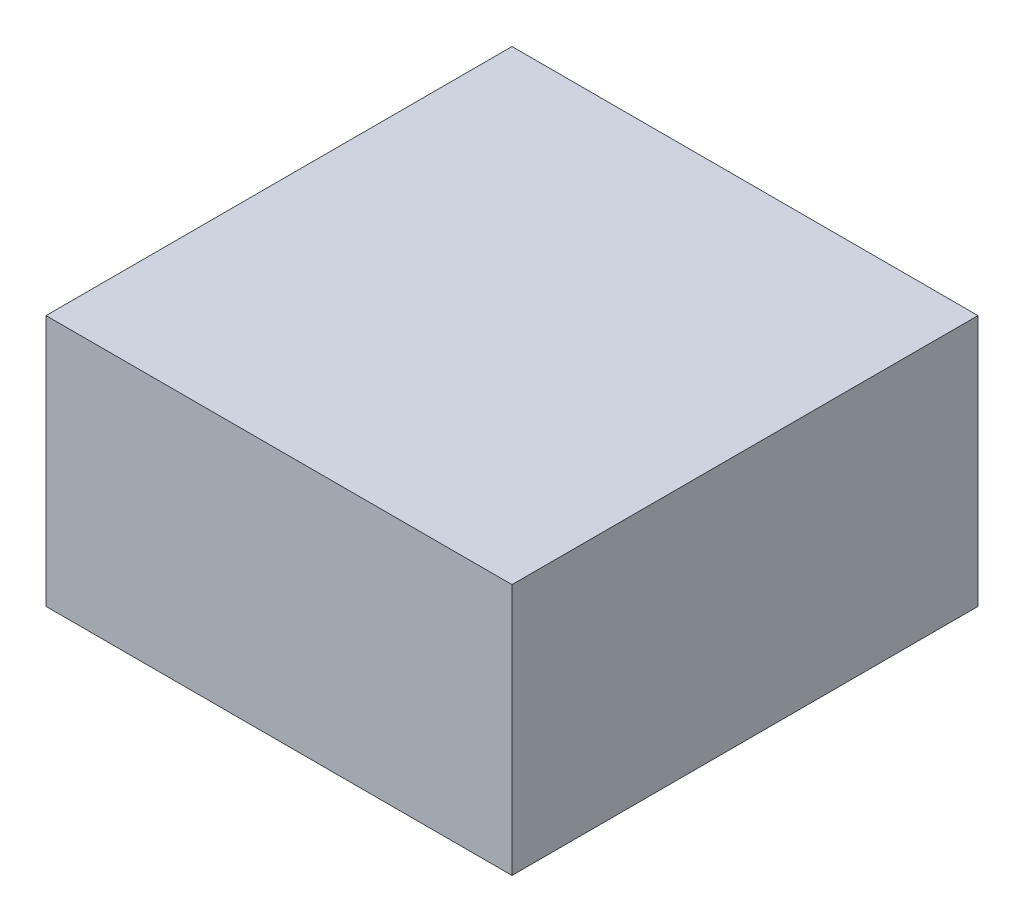
ISO-10303-21;
HEADER;
FILE_DESCRIPTION(('STEP AP214'),'2;1');
FILE_NAME('part.step','',(''),(''),'','','');
FILE_SCHEMA(('AUTOMOTIVE_DESIGN { 1 0 10303 214 1 1 1 1 }'));
ENDSEC;
DATA;
#1=APPLICATION_CONTEXT('core data for automotive mechanical design processes');
#2=APPLICATION_PROTOCOL_DEFINITION('international standard','automotive_design',2000,#1);
#3=PRODUCT_CONTEXT('',#1,'mechanical');
#4=PRODUCT('Part','Part','',(#3));
#5=PRODUCT_RELATED_PRODUCT_CATEGORY('part','',(#4));
#6=PRODUCT_DEFINITION_FORMATION('','',#4);
#7=PRODUCT_DEFINITION_CONTEXT('part definition',#1,'design');
#8=PRODUCT_DEFINITION('design','',#6,#7);
#9=PRODUCT_DEFINITION_SHAPE('','',#8);
#10=(LENGTH_UNIT() NAMED_UNIT(*) SI_UNIT(.MILLI.,.METRE.));
#11=(NAMED_UNIT(*) PLANE_ANGLE_UNIT() SI_UNIT($,.RADIAN.));
#12=(NAMED_UNIT(*) SI_UNIT($,.STERADIAN.) SOLID_ANGLE_UNIT());
#13=UNCERTAINTY_MEASURE_WITH_UNIT(LENGTH_MEASURE(1.E-05),#10,'distance_accuracy_value','');
#14=(GEOMETRIC_REPRESENTATION_CONTEXT(3) GLOBAL_UNCERTAINTY_ASSIGNED_CONTEXT((#13)) GLOBAL_UNIT_ASSIGNED_CONTEXT((#10,
#11,#12)) REPRESENTATION_CONTEXT('',''));
#15=CARTESIAN_POINT('',(0.,0.,0.));
#16=DIRECTION('',(0.,0.,1.));
#17=DIRECTION('',(1.,0.,0.));
#18=AXIS2_PLACEMENT_3D('',#15,#16,#17);
#19=CARTESIAN_POINT('',(0.,0.,0.));
#20=DIRECTION('',(0.,1.,0.));
#21=DIRECTION('',(0.,0.,1.));
#22=AXIS2_PLACEMENT_3D('',#19,#20,#21);
#23=PLANE('',#22);
#24=DIRECTION('',(0.,0.,1.));
#25=VECTOR('',#24,1.);
#26=CARTESIAN_POINT('',(-63.9353314093189,0.,-19.5600550966808));
#27=LINE('',#26,#25);
#28=CARTESIAN_POINT('',(-63.9353314093189,0.,-19.5600550966808));
#29=VERTEX_POINT('',#28);
#30=CARTESIAN_POINT('',(-63.9353314093189,0.,-1.06005509668079));
#31=VERTEX_POINT('',#30);
#32=EDGE_CURVE('E193',#29,#31,#27,.T.);
#33=ORIENTED_EDGE('',*,*,#32,.F.);
#34=DIRECTION('',(1.,0.,0.));
#35=VECTOR('',#34,1.);
#36=CARTESIAN_POINT('',(-63.9353314093189,0.,-19.5600550966808));
#37=LINE('',#36,#35);
#38=CARTESIAN_POINT('',(-45.4353314093189,0.,-19.5600550966808));
#39=VERTEX_POINT('',#38);
#40=EDGE_CURVE('E202',#29,#39,#37,.T.);
#41=ORIENTED_EDGE('',*,*,#40,.T.);
#42=DIRECTION('',(0.,0.,1.));
#43=VECTOR('',#42,1.);
#44=CARTESIAN_POINT('',(-45.4353314093189,0.,-19.5600550966808));
#45=LINE('',#44,#43);
#46=CARTESIAN_POINT('',(-45.4353314093189,0.,-1.06005509668079));
#47=VERTEX_POINT('',#46);
#48=EDGE_CURVE('E215',#39,#47,#45,.T.);
#49=ORIENTED_EDGE('',*,*,#48,.T.);
#50=DIRECTION('',(1.,0.,0.));
#51=VECTOR('',#50,1.);
#52=CARTESIAN_POINT('',(-63.9353314093189,0.,-1.06005509668079));
#53=LINE('',#52,#51);
#54=EDGE_CURVE('E209',#31,#47,#53,.T.);
#55=ORIENTED_EDGE('',*,*,#54,.F.);
#56=EDGE_LOOP('',(#33,#41,#49,#55));
#57=FACE_BOUND('',#56,.T.);
#58=DIRECTION('',(0.,0.,1.));
#59=VECTOR('',#58,1.);
#60=CARTESIAN_POINT('',(-47.1853261692801,0.,0.));
#61=LINE('',#60,#59);
#62=CARTESIAN_POINT('',(-47.1853261692801,0.,-17.8100529018971));
#63=VERTEX_POINT('',#62);
#64=CARTESIAN_POINT('',(-47.1853261692801,0.,-2.81005290189709));
#65=VERTEX_POINT('',#64);
#66=EDGE_CURVE('E12',#63,#65,#61,.T.);
#67=ORIENTED_EDGE('',*,*,#66,.F.);
#68=DIRECTION('',(1.,0.,0.));
#69=VECTOR('',#68,1.);
#70=CARTESIAN_POINT('',(0.,0.,-17.8100529018971));
#71=LINE('',#70,#69);
#72=CARTESIAN_POINT('',(-62.1853261692801,0.,-17.8100529018971));
#73=VERTEX_POINT('',#72);
#74=EDGE_CURVE('E175',#73,#63,#71,.T.);
#75=ORIENTED_EDGE('',*,*,#74,.F.);
#76=DIRECTION('',(0.,0.,1.));
#77=VECTOR('',#76,1.);
#78=CARTESIAN_POINT('',(-62.1853261692801,0.,0.));
#79=LINE('',#78,#77);
#80=CARTESIAN_POINT('',(-62.1853261692801,0.,-2.81005290189709));
#81=VERTEX_POINT('',#80);
#82=EDGE_CURVE('E223',#73,#81,#79,.T.);
#83=ORIENTED_EDGE('',*,*,#82,.T.);
#84=DIRECTION('',(1.,0.,0.));
#85=VECTOR('',#84,1.);
#86=CARTESIAN_POINT('',(0.,0.,-2.81005290189709));
#87=LINE('',#86,#85);
#88=EDGE_CURVE('E101',#81,#65,#87,.T.);
#89=ORIENTED_EDGE('',*,*,#88,.T.);
#90=EDGE_LOOP('',(#67,#75,#83,#89));
#91=FACE_BOUND('',#90,.T.);
#92=ADVANCED_FACE('F93',(#57,#91),#23,.F.);
#93=CARTESIAN_POINT('',(-63.9353314093189,10.,-19.5600550966808));
#94=DIRECTION('',(1.,0.,0.));
#95=DIRECTION('',(0.,0.,-1.));
#96=AXIS2_PLACEMENT_3D('',#93,#94,#95);
#97=PLANE('',#96);
#98=ORIENTED_EDGE('',*,*,#32,.T.);
#99=DIRECTION('',(0.,-1.,0.));
#100=VECTOR('',#99,1.);
#101=CARTESIAN_POINT('',(-63.9353314093189,10.,-1.06005509668079));
#102=LINE('',#101,#100);
#103=CARTESIAN_POINT('',(-63.9353314093189,10.,-1.06005509668079));
#104=VERTEX_POINT('',#103);
#105=EDGE_CURVE('E225',#104,#31,#102,.T.);
#106=ORIENTED_EDGE('',*,*,#105,.F.);
#107=DIRECTION('',(0.,0.,1.));
#108=VECTOR('',#107,1.);
#109=CARTESIAN_POINT('',(-63.9353314093189,10.,-19.5600550966808));
#110=LINE('',#109,#108);
#111=CARTESIAN_POINT('',(-63.9353314093189,10.,-19.5600550966808));
#112=VERTEX_POINT('',#111);
#113=EDGE_CURVE('E196',#112,#104,#110,.T.);
#114=ORIENTED_EDGE('',*,*,#113,.F.);
#115=DIRECTION('',(0.,-1.,0.));
#116=VECTOR('',#115,1.);
#117=CARTESIAN_POINT('',(-63.9353314093189,10.,-19.5600550966808));
#118=LINE('',#117,#116);
#119=EDGE_CURVE('E118',#112,#29,#118,.T.);
#120=ORIENTED_EDGE('',*,*,#119,.T.);
#121=EDGE_LOOP('',(#98,#106,#114,#120));
#122=FACE_BOUND('',#121,.T.);
#123=ADVANCED_FACE('F97',(#122),#97,.F.);
#124=CARTESIAN_POINT('',(-63.9353314093189,10.,-1.06005509668079));
#125=DIRECTION('',(0.,0.,-1.));
#126=DIRECTION('',(-1.,0.,0.));
#127=AXIS2_PLACEMENT_3D('',#124,#125,#126);
#128=PLANE('',#127);
#129=ORIENTED_EDGE('',*,*,#54,.T.);
#130=DIRECTION('',(0.,-1.,0.));
#131=VECTOR('',#130,1.);
#132=CARTESIAN_POINT('',(-45.4353314093189,10.,-1.06005509668079));
#133=LINE('',#132,#131);
#134=CARTESIAN_POINT('',(-45.4353314093189,10.,-1.06005509668079));
#135=VERTEX_POINT('',#134);
#136=EDGE_CURVE('E218',#135,#47,#133,.T.);
#137=ORIENTED_EDGE('',*,*,#136,.F.);
#138=DIRECTION('',(1.,0.,0.));
#139=VECTOR('',#138,1.);
#140=CARTESIAN_POINT('',(-63.9353314093189,10.,-1.06005509668079));
#141=LINE('',#140,#139);
#142=EDGE_CURVE('E147',#104,#135,#141,.T.);
#143=ORIENTED_EDGE('',*,*,#142,.F.);
#144=ORIENTED_EDGE('',*,*,#105,.T.);
#145=EDGE_LOOP('',(#129,#137,#143,#144));
#146=FACE_BOUND('',#145,.T.);
#147=ADVANCED_FACE('F249',(#146),#128,.F.);
#148=CARTESIAN_POINT('',(-45.4353314093189,10.,-19.5600550966808));
#149=DIRECTION('',(1.,0.,0.));
#150=DIRECTION('',(0.,0.,-1.));
#151=AXIS2_PLACEMENT_3D('',#148,#149,#150);
#152=PLANE('',#151);
#153=ORIENTED_EDGE('',*,*,#48,.F.);
#154=DIRECTION('',(0.,-1.,0.));
#155=VECTOR('',#154,1.);
#156=CARTESIAN_POINT('',(-45.4353314093189,10.,-19.5600550966808));
#157=LINE('',#156,#155);
#158=CARTESIAN_POINT('',(-45.4353314093189,10.,-19.5600550966808));
#159=VERTEX_POINT('',#158);
#160=EDGE_CURVE('E220',#159,#39,#157,.T.);
#161=ORIENTED_EDGE('',*,*,#160,.F.);
#162=DIRECTION('',(0.,0.,1.));
#163=VECTOR('',#162,1.);
#164=CARTESIAN_POINT('',(-45.4353314093189,10.,-19.5600550966808));
#165=LINE('',#164,#163);
#166=EDGE_CURVE('E204',#159,#135,#165,.T.);
#167=ORIENTED_EDGE('',*,*,#166,.T.);
#168=ORIENTED_EDGE('',*,*,#136,.T.);
#169=EDGE_LOOP('',(#153,#161,#167,#168));
#170=FACE_BOUND('',#169,.T.);
#171=ADVANCED_FACE('F259',(#170),#152,.T.);
#172=CARTESIAN_POINT('',(-63.9353314093189,10.,-19.5600550966808));
#173=DIRECTION('',(0.,0.,-1.));
#174=DIRECTION('',(-1.,0.,0.));
#175=AXIS2_PLACEMENT_3D('',#172,#173,#174);
#176=PLANE('',#175);
#177=ORIENTED_EDGE('',*,*,#40,.F.);
#178=ORIENTED_EDGE('',*,*,#119,.F.);
#179=DIRECTION('',(1.,0.,0.));
#180=VECTOR('',#179,1.);
#181=CARTESIAN_POINT('',(-63.9353314093189,10.,-19.5600550966808));
#182=LINE('',#181,#180);
#183=EDGE_CURVE('E207',#112,#159,#182,.T.);
#184=ORIENTED_EDGE('',*,*,#183,.T.);
#185=ORIENTED_EDGE('',*,*,#160,.T.);
#186=EDGE_LOOP('',(#177,#178,#184,#185));
#187=FACE_BOUND('',#186,.T.);
#188=ADVANCED_FACE('F253',(#187),#176,.T.);
#189=CARTESIAN_POINT('',(0.,10.,0.));
#190=DIRECTION('',(0.,1.,0.));
#191=DIRECTION('',(0.,0.,1.));
#192=AXIS2_PLACEMENT_3D('',#189,#190,#191);
#193=PLANE('',#192);
#194=ORIENTED_EDGE('',*,*,#113,.T.);
#195=ORIENTED_EDGE('',*,*,#142,.T.);
#196=ORIENTED_EDGE('',*,*,#166,.F.);
#197=ORIENTED_EDGE('',*,*,#183,.F.);
#198=EDGE_LOOP('',(#194,#195,#196,#197));
#199=FACE_BOUND('',#198,.T.);
#200=ADVANCED_FACE('F254',(#199),#193,.T.);
#201=CARTESIAN_POINT('',(-47.1853261692801,-10.,0.));
#202=DIRECTION('',(-1.,0.,0.));
#203=DIRECTION('',(0.,0.,1.));
#204=AXIS2_PLACEMENT_3D('',#201,#202,#203);
#205=PLANE('',#204);
#206=ORIENTED_EDGE('',*,*,#66,.T.);
#207=DIRECTION('',(0.,1.,0.));
#208=VECTOR('',#207,1.);
#209=CARTESIAN_POINT('',(-47.1853261692801,-10.,-2.81005290189709));
#210=LINE('',#209,#208);
#211=CARTESIAN_POINT('',(-47.1853261692801,8.,-2.81005290189709));
#212=VERTEX_POINT('',#211);
#213=EDGE_CURVE('E181',#65,#212,#210,.T.);
#214=ORIENTED_EDGE('',*,*,#213,.T.);
#215=DIRECTION('',(0.,0.,1.));
#216=VECTOR('',#215,1.);
#217=CARTESIAN_POINT('',(-47.1853261692801,8.,0.));
#218=LINE('',#217,#216);
#219=CARTESIAN_POINT('',(-47.1853261692801,8.,-17.8100529018971));
#220=VERTEX_POINT('',#219);
#221=EDGE_CURVE('E178',#220,#212,#218,.T.);
#222=ORIENTED_EDGE('',*,*,#221,.F.);
#223=DIRECTION('',(0.,1.,0.));
#224=VECTOR('',#223,1.);
#225=CARTESIAN_POINT('',(-47.1853261692801,-10.,-17.8100529018971));
#226=LINE('',#225,#224);
#227=EDGE_CURVE('E168',#63,#220,#226,.T.);
#228=ORIENTED_EDGE('',*,*,#227,.F.);
#229=EDGE_LOOP('',(#206,#214,#222,#228));
#230=FACE_BOUND('',#229,.T.);
#231=ADVANCED_FACE('F177',(#230),#205,.T.);
#232=CARTESIAN_POINT('',(0.,-10.,-2.81005290189709));
#233=DIRECTION('',(0.,0.,1.));
#234=DIRECTION('',(1.,0.,0.));
#235=AXIS2_PLACEMENT_3D('',#232,#233,#234);
#236=PLANE('',#235);
#237=DIRECTION('',(0.,1.,0.));
#238=VECTOR('',#237,1.);
#239=CARTESIAN_POINT('',(-62.1853261692801,-10.,-2.81005290189709));
#240=LINE('',#239,#238);
#241=CARTESIAN_POINT('',(-62.1853261692801,8.,-2.81005290189709));
#242=VERTEX_POINT('',#241);
#243=EDGE_CURVE('E197',#81,#242,#240,.T.);
#244=ORIENTED_EDGE('',*,*,#243,.T.);
#245=DIRECTION('',(1.,0.,0.));
#246=VECTOR('',#245,1.);
#247=CARTESIAN_POINT('',(0.,8.,-2.81005290189709));
#248=LINE('',#247,#246);
#249=EDGE_CURVE('E174',#242,#212,#248,.T.);
#250=ORIENTED_EDGE('',*,*,#249,.T.);
#251=ORIENTED_EDGE('',*,*,#213,.F.);
#252=ORIENTED_EDGE('',*,*,#88,.F.);
#253=EDGE_LOOP('',(#244,#250,#251,#252));
#254=FACE_BOUND('',#253,.T.);
#255=ADVANCED_FACE('F233',(#254),#236,.F.);
#256=CARTESIAN_POINT('',(-62.1853261692801,-10.,0.));
#257=DIRECTION('',(-1.,0.,0.));
#258=DIRECTION('',(0.,0.,1.));
#259=AXIS2_PLACEMENT_3D('',#256,#257,#258);
#260=PLANE('',#259);
#261=DIRECTION('',(0.,1.,0.));
#262=VECTOR('',#261,1.);
#263=CARTESIAN_POINT('',(-62.1853261692801,-10.,-17.8100529018971));
#264=LINE('',#263,#262);
#265=CARTESIAN_POINT('',(-62.1853261692801,8.,-17.8100529018971));
#266=VERTEX_POINT('',#265);
#267=EDGE_CURVE('E109',#73,#266,#264,.T.);
#268=ORIENTED_EDGE('',*,*,#267,.T.);
#269=DIRECTION('',(0.,0.,1.));
#270=VECTOR('',#269,1.);
#271=CARTESIAN_POINT('',(-62.1853261692801,8.,0.));
#272=LINE('',#271,#270);
#273=EDGE_CURVE('E186',#266,#242,#272,.T.);
#274=ORIENTED_EDGE('',*,*,#273,.T.);
#275=ORIENTED_EDGE('',*,*,#243,.F.);
#276=ORIENTED_EDGE('',*,*,#82,.F.);
#277=EDGE_LOOP('',(#268,#274,#275,#276));
#278=FACE_BOUND('',#277,.T.);
#279=ADVANCED_FACE('F231',(#278),#260,.F.);
#280=CARTESIAN_POINT('',(0.,-10.,-17.8100529018971));
#281=DIRECTION('',(0.,0.,1.));
#282=DIRECTION('',(1.,0.,0.));
#283=AXIS2_PLACEMENT_3D('',#280,#281,#282);
#284=PLANE('',#283);
#285=ORIENTED_EDGE('',*,*,#74,.T.);
#286=ORIENTED_EDGE('',*,*,#227,.T.);
#287=DIRECTION('',(1.,0.,0.));
#288=VECTOR('',#287,1.);
#289=CARTESIAN_POINT('',(0.,8.,-17.8100529018971));
#290=LINE('',#289,#288);
#291=EDGE_CURVE('E167',#266,#220,#290,.T.);
#292=ORIENTED_EDGE('',*,*,#291,.F.);
#293=ORIENTED_EDGE('',*,*,#267,.F.);
#294=EDGE_LOOP('',(#285,#286,#292,#293));
#295=FACE_BOUND('',#294,.T.);
#296=ADVANCED_FACE('F166',(#295),#284,.T.);
#297=CARTESIAN_POINT('',(0.,8.,0.));
#298=DIRECTION('',(0.,1.,0.));
#299=DIRECTION('',(0.,0.,1.));
#300=AXIS2_PLACEMENT_3D('',#297,#298,#299);
#301=PLANE('',#300);
#302=ORIENTED_EDGE('',*,*,#221,.T.);
#303=ORIENTED_EDGE('',*,*,#249,.F.);
#304=ORIENTED_EDGE('',*,*,#273,.F.);
#305=ORIENTED_EDGE('',*,*,#291,.T.);
#306=EDGE_LOOP('',(#302,#303,#304,#305));
#307=FACE_BOUND('',#306,.T.);
#308=ADVANCED_FACE('F190',(#307),#301,.F.);
#309=CLOSED_SHELL('',(#92,#123,#147,#171,#188,#200,#231,#255,#279,#296,#308));
#310=MANIFOLD_SOLID_BREP('B2',#309);
#311=ADVANCED_BREP_SHAPE_REPRESENTATION('',(#18,#310),#14);
#312=SHAPE_DEFINITION_REPRESENTATION(#9,#311);
ENDSEC;
END-ISO-10303-21;
